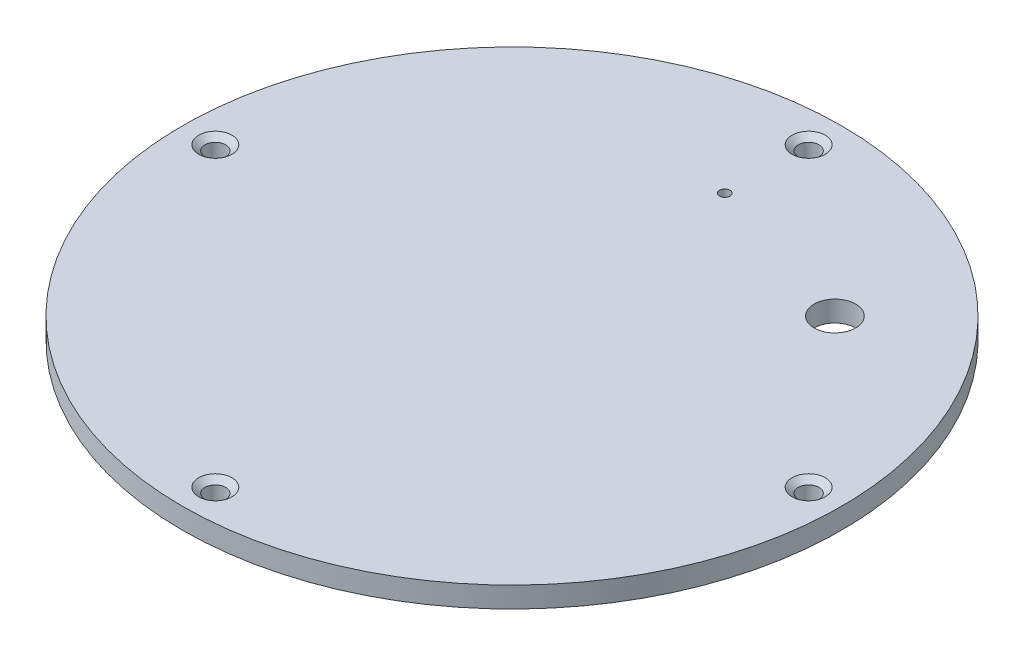
ISO-10303-21;
HEADER;
FILE_DESCRIPTION(('STEP AP214'),'2;1');
FILE_NAME('part.step','',(''),(''),'','','');
FILE_SCHEMA(('AUTOMOTIVE_DESIGN { 1 0 10303 214 1 1 1 1 }'));
ENDSEC;
DATA;
#1=APPLICATION_CONTEXT('core data for automotive mechanical design processes');
#2=APPLICATION_PROTOCOL_DEFINITION('international standard','automotive_design',2000,#1);
#3=PRODUCT_CONTEXT('',#1,'mechanical');
#4=PRODUCT('Part','Part','',(#3));
#5=PRODUCT_RELATED_PRODUCT_CATEGORY('part','',(#4));
#6=PRODUCT_DEFINITION_FORMATION('','',#4);
#7=PRODUCT_DEFINITION_CONTEXT('part definition',#1,'design');
#8=PRODUCT_DEFINITION('design','',#6,#7);
#9=PRODUCT_DEFINITION_SHAPE('','',#8);
#10=(LENGTH_UNIT() NAMED_UNIT(*) SI_UNIT(.MILLI.,.METRE.));
#11=(NAMED_UNIT(*) PLANE_ANGLE_UNIT() SI_UNIT($,.RADIAN.));
#12=(NAMED_UNIT(*) SI_UNIT($,.STERADIAN.) SOLID_ANGLE_UNIT());
#13=UNCERTAINTY_MEASURE_WITH_UNIT(LENGTH_MEASURE(1.E-05),#10,'distance_accuracy_value','');
#14=(GEOMETRIC_REPRESENTATION_CONTEXT(3) GLOBAL_UNCERTAINTY_ASSIGNED_CONTEXT((#13)) GLOBAL_UNIT_ASSIGNED_CONTEXT((#10,
#11,#12)) REPRESENTATION_CONTEXT('',''));
#15=CARTESIAN_POINT('',(0.,0.,0.));
#16=DIRECTION('',(0.,0.,1.));
#17=DIRECTION('',(1.,0.,0.));
#18=AXIS2_PLACEMENT_3D('',#15,#16,#17);
#19=CARTESIAN_POINT('',(0.,1.,0.));
#20=DIRECTION('',(0.,-1.,0.));
#21=DIRECTION('',(0.,0.,-1.));
#22=AXIS2_PLACEMENT_3D('',#19,#20,#21);
#23=CYLINDRICAL_SURFACE('',#22,15.875);
#24=CARTESIAN_POINT('',(0.,1.,0.));
#25=DIRECTION('',(0.,1.,0.));
#26=DIRECTION('',(0.,0.,1.));
#27=AXIS2_PLACEMENT_3D('',#24,#25,#26);
#28=CIRCLE('',#27,15.875);
#29=CARTESIAN_POINT('',(0.,1.,15.875));
#30=VERTEX_POINT('',#29);
#31=EDGE_CURVE('E10',#30,#30,#28,.T.);
#32=ORIENTED_EDGE('',*,*,#31,.F.);
#33=EDGE_LOOP('',(#32));
#34=FACE_BOUND('',#33,.T.);
#35=CARTESIAN_POINT('',(0.,0.,0.));
#36=DIRECTION('',(0.,1.,0.));
#37=DIRECTION('',(0.,0.,1.));
#38=AXIS2_PLACEMENT_3D('',#35,#36,#37);
#39=CIRCLE('',#38,15.875);
#40=CARTESIAN_POINT('',(0.,0.,15.875));
#41=VERTEX_POINT('',#40);
#42=EDGE_CURVE('E35',#41,#41,#39,.T.);
#43=ORIENTED_EDGE('',*,*,#42,.T.);
#44=EDGE_LOOP('',(#43));
#45=FACE_BOUND('',#44,.T.);
#46=ADVANCED_FACE('F32',(#34,#45),#23,.T.);
#47=CARTESIAN_POINT('',(0.,1.,0.));
#48=DIRECTION('',(0.,1.,0.));
#49=DIRECTION('',(0.,0.,1.));
#50=AXIS2_PLACEMENT_3D('',#47,#48,#49);
#51=PLANE('',#50);
#52=CARTESIAN_POINT('',(0.,1.,-14.29));
#53=DIRECTION('',(0.,1.,0.));
#54=DIRECTION('',(0.,0.,1.));
#55=AXIS2_PLACEMENT_3D('',#52,#53,#54);
#56=CIRCLE('',#55,0.8);
#57=CARTESIAN_POINT('',(0.,1.,-13.49));
#58=VERTEX_POINT('',#57);
#59=EDGE_CURVE('E88',#58,#58,#56,.T.);
#60=ORIENTED_EDGE('',*,*,#59,.F.);
#61=EDGE_LOOP('',(#60));
#62=FACE_BOUND('',#61,.T.);
#63=CARTESIAN_POINT('',(-14.29,1.,0.));
#64=DIRECTION('',(0.,1.,0.));
#65=DIRECTION('',(0.,0.,1.));
#66=AXIS2_PLACEMENT_3D('',#63,#64,#65);
#67=CIRCLE('',#66,0.8);
#68=CARTESIAN_POINT('',(-14.29,1.,0.8));
#69=VERTEX_POINT('',#68);
#70=EDGE_CURVE('E79',#69,#69,#67,.T.);
#71=ORIENTED_EDGE('',*,*,#70,.F.);
#72=EDGE_LOOP('',(#71));
#73=FACE_BOUND('',#72,.T.);
#74=CARTESIAN_POINT('',(0.,1.,14.29));
#75=DIRECTION('',(0.,1.,0.));
#76=DIRECTION('',(0.,0.,1.));
#77=AXIS2_PLACEMENT_3D('',#74,#75,#76);
#78=CIRCLE('',#77,0.8);
#79=CARTESIAN_POINT('',(0.,1.,15.09));
#80=VERTEX_POINT('',#79);
#81=EDGE_CURVE('E70',#80,#80,#78,.T.);
#82=ORIENTED_EDGE('',*,*,#81,.F.);
#83=EDGE_LOOP('',(#82));
#84=FACE_BOUND('',#83,.T.);
#85=CARTESIAN_POINT('',(14.29,1.,0.));
#86=DIRECTION('',(0.,1.,0.));
#87=DIRECTION('',(0.,0.,1.));
#88=AXIS2_PLACEMENT_3D('',#85,#86,#87);
#89=CIRCLE('',#88,0.8);
#90=CARTESIAN_POINT('',(14.29,1.,0.8));
#91=VERTEX_POINT('',#90);
#92=EDGE_CURVE('E61',#91,#91,#89,.T.);
#93=ORIENTED_EDGE('',*,*,#92,.F.);
#94=EDGE_LOOP('',(#93));
#95=FACE_BOUND('',#94,.T.);
#96=CARTESIAN_POINT('',(0.,1.,-10.25));
#97=DIRECTION('',(0.,1.,0.));
#98=DIRECTION('',(0.,0.,1.));
#99=AXIS2_PLACEMENT_3D('',#96,#97,#98);
#100=CIRCLE('',#99,0.25);
#101=CARTESIAN_POINT('',(0.,1.,-10.));
#102=VERTEX_POINT('',#101);
#103=EDGE_CURVE('E42',#102,#102,#100,.T.);
#104=ORIENTED_EDGE('',*,*,#103,.F.);
#105=EDGE_LOOP('',(#104));
#106=FACE_BOUND('',#105,.T.);
#107=CARTESIAN_POINT('',(7.77817459305201,1.,-7.77817459305204));
#108=DIRECTION('',(0.,1.,0.));
#109=DIRECTION('',(0.,0.,1.));
#110=AXIS2_PLACEMENT_3D('',#107,#108,#109);
#111=CIRCLE('',#110,1.00000000000001);
#112=CARTESIAN_POINT('',(7.77817459305201,1.,-6.77817459305203));
#113=VERTEX_POINT('',#112);
#114=EDGE_CURVE('E46',#113,#113,#111,.T.);
#115=ORIENTED_EDGE('',*,*,#114,.F.);
#116=EDGE_LOOP('',(#115));
#117=FACE_BOUND('',#116,.T.);
#118=ORIENTED_EDGE('',*,*,#31,.T.);
#119=EDGE_LOOP('',(#118));
#120=FACE_BOUND('',#119,.T.);
#121=ADVANCED_FACE('F94',(#62,#73,#84,#95,#106,#117,#120),#51,.T.);
#122=CARTESIAN_POINT('',(0.,0.,0.));
#123=DIRECTION('',(0.,1.,0.));
#124=DIRECTION('',(0.,0.,1.));
#125=AXIS2_PLACEMENT_3D('',#122,#123,#124);
#126=PLANE('',#125);
#127=CARTESIAN_POINT('',(0.,0.,-14.29));
#128=DIRECTION('',(0.,1.,0.));
#129=DIRECTION('',(0.,0.,1.));
#130=AXIS2_PLACEMENT_3D('',#127,#128,#129);
#131=CIRCLE('',#130,0.5);
#132=CARTESIAN_POINT('',(0.,0.,-13.79));
#133=VERTEX_POINT('',#132);
#134=EDGE_CURVE('E82',#133,#133,#131,.T.);
#135=ORIENTED_EDGE('',*,*,#134,.T.);
#136=EDGE_LOOP('',(#135));
#137=FACE_BOUND('',#136,.T.);
#138=CARTESIAN_POINT('',(-14.29,0.,0.));
#139=DIRECTION('',(0.,1.,0.));
#140=DIRECTION('',(0.,0.,1.));
#141=AXIS2_PLACEMENT_3D('',#138,#139,#140);
#142=CIRCLE('',#141,0.5);
#143=CARTESIAN_POINT('',(-14.29,0.,0.5));
#144=VERTEX_POINT('',#143);
#145=EDGE_CURVE('E73',#144,#144,#142,.T.);
#146=ORIENTED_EDGE('',*,*,#145,.T.);
#147=EDGE_LOOP('',(#146));
#148=FACE_BOUND('',#147,.T.);
#149=CARTESIAN_POINT('',(0.,0.,14.29));
#150=DIRECTION('',(0.,1.,0.));
#151=DIRECTION('',(0.,0.,1.));
#152=AXIS2_PLACEMENT_3D('',#149,#150,#151);
#153=CIRCLE('',#152,0.5);
#154=CARTESIAN_POINT('',(0.,0.,14.79));
#155=VERTEX_POINT('',#154);
#156=EDGE_CURVE('E64',#155,#155,#153,.T.);
#157=ORIENTED_EDGE('',*,*,#156,.T.);
#158=EDGE_LOOP('',(#157));
#159=FACE_BOUND('',#158,.T.);
#160=CARTESIAN_POINT('',(14.29,0.,0.));
#161=DIRECTION('',(0.,1.,0.));
#162=DIRECTION('',(0.,0.,1.));
#163=AXIS2_PLACEMENT_3D('',#160,#161,#162);
#164=CIRCLE('',#163,0.5);
#165=CARTESIAN_POINT('',(14.29,0.,0.5));
#166=VERTEX_POINT('',#165);
#167=EDGE_CURVE('E53',#166,#166,#164,.T.);
#168=ORIENTED_EDGE('',*,*,#167,.T.);
#169=EDGE_LOOP('',(#168));
#170=FACE_BOUND('',#169,.T.);
#171=CARTESIAN_POINT('',(0.,0.,-10.25));
#172=DIRECTION('',(0.,1.,0.));
#173=DIRECTION('',(0.,0.,1.));
#174=AXIS2_PLACEMENT_3D('',#171,#172,#173);
#175=CIRCLE('',#174,0.25);
#176=CARTESIAN_POINT('',(0.,0.,-10.));
#177=VERTEX_POINT('',#176);
#178=EDGE_CURVE('E49',#177,#177,#175,.T.);
#179=ORIENTED_EDGE('',*,*,#178,.T.);
#180=EDGE_LOOP('',(#179));
#181=FACE_BOUND('',#180,.T.);
#182=CARTESIAN_POINT('',(7.77817459305201,0.,-7.77817459305204));
#183=DIRECTION('',(0.,1.,0.));
#184=DIRECTION('',(0.,0.,1.));
#185=AXIS2_PLACEMENT_3D('',#182,#183,#184);
#186=CIRCLE('',#185,1.00000000000001);
#187=CARTESIAN_POINT('',(7.77817459305201,0.,-6.77817459305203));
#188=VERTEX_POINT('',#187);
#189=EDGE_CURVE('E50',#188,#188,#186,.T.);
#190=ORIENTED_EDGE('',*,*,#189,.T.);
#191=EDGE_LOOP('',(#190));
#192=FACE_BOUND('',#191,.T.);
#193=ORIENTED_EDGE('',*,*,#42,.F.);
#194=EDGE_LOOP('',(#193));
#195=FACE_BOUND('',#194,.T.);
#196=ADVANCED_FACE('F97',(#137,#148,#159,#170,#181,#192,#195),#126,.F.);
#197=CARTESIAN_POINT('',(7.77817459305201,0.,-7.77817459305204));
#198=DIRECTION('',(0.,1.,0.));
#199=DIRECTION('',(0.,0.,1.));
#200=AXIS2_PLACEMENT_3D('',#197,#198,#199);
#201=CYLINDRICAL_SURFACE('',#200,1.00000000000001);
#202=ORIENTED_EDGE('',*,*,#114,.T.);
#203=EDGE_LOOP('',(#202));
#204=FACE_BOUND('',#203,.T.);
#205=ORIENTED_EDGE('',*,*,#189,.F.);
#206=EDGE_LOOP('',(#205));
#207=FACE_BOUND('',#206,.T.);
#208=ADVANCED_FACE('F109',(#204,#207),#201,.F.);
#209=CARTESIAN_POINT('',(0.,0.,-10.25));
#210=DIRECTION('',(0.,1.,0.));
#211=DIRECTION('',(0.,0.,1.));
#212=AXIS2_PLACEMENT_3D('',#209,#210,#211);
#213=CYLINDRICAL_SURFACE('',#212,0.25);
#214=ORIENTED_EDGE('',*,*,#103,.T.);
#215=EDGE_LOOP('',(#214));
#216=FACE_BOUND('',#215,.T.);
#217=ORIENTED_EDGE('',*,*,#178,.F.);
#218=EDGE_LOOP('',(#217));
#219=FACE_BOUND('',#218,.T.);
#220=ADVANCED_FACE('F112',(#216,#219),#213,.F.);
#221=CARTESIAN_POINT('',(14.29,1.,0.));
#222=DIRECTION('',(0.,1.,0.));
#223=DIRECTION('',(0.,0.,1.));
#224=AXIS2_PLACEMENT_3D('',#221,#222,#223);
#225=CYLINDRICAL_SURFACE('',#224,0.5);
#226=ORIENTED_EDGE('',*,*,#167,.F.);
#227=EDGE_LOOP('',(#226));
#228=FACE_BOUND('',#227,.T.);
#229=CARTESIAN_POINT('',(14.29,0.748270110646816,0.));
#230=DIRECTION('',(0.,1.,0.));
#231=DIRECTION('',(0.,0.,1.));
#232=AXIS2_PLACEMENT_3D('',#229,#230,#231);
#233=CIRCLE('',#232,0.5);
#234=CARTESIAN_POINT('',(14.29,0.748270110646816,0.5));
#235=VERTEX_POINT('',#234);
#236=EDGE_CURVE('E58',#235,#235,#233,.T.);
#237=ORIENTED_EDGE('',*,*,#236,.T.);
#238=EDGE_LOOP('',(#237));
#239=FACE_BOUND('',#238,.T.);
#240=ADVANCED_FACE('F144',(#228,#239),#225,.F.);
#241=CARTESIAN_POINT('',(14.29,1.,0.));
#242=DIRECTION('',(0.,1.,0.));
#243=DIRECTION('',(0.,0.,1.));
#244=AXIS2_PLACEMENT_3D('',#241,#242,#243);
#245=CONICAL_SURFACE('',#244,0.8,0.872664625997165);
#246=ORIENTED_EDGE('',*,*,#236,.F.);
#247=EDGE_LOOP('',(#246));
#248=FACE_BOUND('',#247,.T.);
#249=ORIENTED_EDGE('',*,*,#92,.T.);
#250=EDGE_LOOP('',(#249));
#251=FACE_BOUND('',#250,.T.);
#252=ADVANCED_FACE('F151',(#248,#251),#245,.F.);
#253=CARTESIAN_POINT('',(0.,1.,14.29));
#254=DIRECTION('',(0.,1.,0.));
#255=DIRECTION('',(0.,0.,1.));
#256=AXIS2_PLACEMENT_3D('',#253,#254,#255);
#257=CYLINDRICAL_SURFACE('',#256,0.5);
#258=ORIENTED_EDGE('',*,*,#156,.F.);
#259=EDGE_LOOP('',(#258));
#260=FACE_BOUND('',#259,.T.);
#261=CARTESIAN_POINT('',(0.,0.748270110646816,14.29));
#262=DIRECTION('',(0.,1.,0.));
#263=DIRECTION('',(0.,0.,1.));
#264=AXIS2_PLACEMENT_3D('',#261,#262,#263);
#265=CIRCLE('',#264,0.5);
#266=CARTESIAN_POINT('',(0.,0.748270110646816,14.79));
#267=VERTEX_POINT('',#266);
#268=EDGE_CURVE('E67',#267,#267,#265,.T.);
#269=ORIENTED_EDGE('',*,*,#268,.T.);
#270=EDGE_LOOP('',(#269));
#271=FACE_BOUND('',#270,.T.);
#272=ADVANCED_FACE('F159',(#260,#271),#257,.F.);
#273=CARTESIAN_POINT('',(0.,1.,14.29));
#274=DIRECTION('',(0.,1.,0.));
#275=DIRECTION('',(0.,0.,1.));
#276=AXIS2_PLACEMENT_3D('',#273,#274,#275);
#277=CONICAL_SURFACE('',#276,0.8,0.872664625997165);
#278=ORIENTED_EDGE('',*,*,#268,.F.);
#279=EDGE_LOOP('',(#278));
#280=FACE_BOUND('',#279,.T.);
#281=ORIENTED_EDGE('',*,*,#81,.T.);
#282=EDGE_LOOP('',(#281));
#283=FACE_BOUND('',#282,.T.);
#284=ADVANCED_FACE('F167',(#280,#283),#277,.F.);
#285=CARTESIAN_POINT('',(-14.29,1.,0.));
#286=DIRECTION('',(0.,1.,0.));
#287=DIRECTION('',(0.,0.,1.));
#288=AXIS2_PLACEMENT_3D('',#285,#286,#287);
#289=CYLINDRICAL_SURFACE('',#288,0.5);
#290=ORIENTED_EDGE('',*,*,#145,.F.);
#291=EDGE_LOOP('',(#290));
#292=FACE_BOUND('',#291,.T.);
#293=CARTESIAN_POINT('',(-14.29,0.748270110646816,0.));
#294=DIRECTION('',(0.,1.,0.));
#295=DIRECTION('',(0.,0.,1.));
#296=AXIS2_PLACEMENT_3D('',#293,#294,#295);
#297=CIRCLE('',#296,0.5);
#298=CARTESIAN_POINT('',(-14.29,0.748270110646816,0.5));
#299=VERTEX_POINT('',#298);
#300=EDGE_CURVE('E76',#299,#299,#297,.T.);
#301=ORIENTED_EDGE('',*,*,#300,.T.);
#302=EDGE_LOOP('',(#301));
#303=FACE_BOUND('',#302,.T.);
#304=ADVANCED_FACE('F175',(#292,#303),#289,.F.);
#305=CARTESIAN_POINT('',(-14.29,1.,0.));
#306=DIRECTION('',(0.,1.,0.));
#307=DIRECTION('',(0.,0.,1.));
#308=AXIS2_PLACEMENT_3D('',#305,#306,#307);
#309=CONICAL_SURFACE('',#308,0.8,0.872664625997165);
#310=ORIENTED_EDGE('',*,*,#300,.F.);
#311=EDGE_LOOP('',(#310));
#312=FACE_BOUND('',#311,.T.);
#313=ORIENTED_EDGE('',*,*,#70,.T.);
#314=EDGE_LOOP('',(#313));
#315=FACE_BOUND('',#314,.T.);
#316=ADVANCED_FACE('F183',(#312,#315),#309,.F.);
#317=CARTESIAN_POINT('',(0.,1.,-14.29));
#318=DIRECTION('',(0.,1.,0.));
#319=DIRECTION('',(0.,0.,1.));
#320=AXIS2_PLACEMENT_3D('',#317,#318,#319);
#321=CYLINDRICAL_SURFACE('',#320,0.5);
#322=ORIENTED_EDGE('',*,*,#134,.F.);
#323=EDGE_LOOP('',(#322));
#324=FACE_BOUND('',#323,.T.);
#325=CARTESIAN_POINT('',(0.,0.748270110646816,-14.29));
#326=DIRECTION('',(0.,1.,0.));
#327=DIRECTION('',(0.,0.,1.));
#328=AXIS2_PLACEMENT_3D('',#325,#326,#327);
#329=CIRCLE('',#328,0.5);
#330=CARTESIAN_POINT('',(0.,0.748270110646816,-13.79));
#331=VERTEX_POINT('',#330);
#332=EDGE_CURVE('E85',#331,#331,#329,.T.);
#333=ORIENTED_EDGE('',*,*,#332,.T.);
#334=EDGE_LOOP('',(#333));
#335=FACE_BOUND('',#334,.T.);
#336=ADVANCED_FACE('F191',(#324,#335),#321,.F.);
#337=CARTESIAN_POINT('',(0.,1.,-14.29));
#338=DIRECTION('',(0.,1.,0.));
#339=DIRECTION('',(0.,0.,1.));
#340=AXIS2_PLACEMENT_3D('',#337,#338,#339);
#341=CONICAL_SURFACE('',#340,0.8,0.872664625997165);
#342=ORIENTED_EDGE('',*,*,#332,.F.);
#343=EDGE_LOOP('',(#342));
#344=FACE_BOUND('',#343,.T.);
#345=ORIENTED_EDGE('',*,*,#59,.T.);
#346=EDGE_LOOP('',(#345));
#347=FACE_BOUND('',#346,.T.);
#348=ADVANCED_FACE('F92',(#344,#347),#341,.F.);
#349=CLOSED_SHELL('',(#46,#121,#196,#208,#220,#240,#252,#272,#284,#304,#316,#336,#348));
#350=MANIFOLD_SOLID_BREP('B2',#349);
#351=ADVANCED_BREP_SHAPE_REPRESENTATION('',(#18,#350),#14);
#352=SHAPE_DEFINITION_REPRESENTATION(#9,#351);
ENDSEC;
END-ISO-10303-21;
